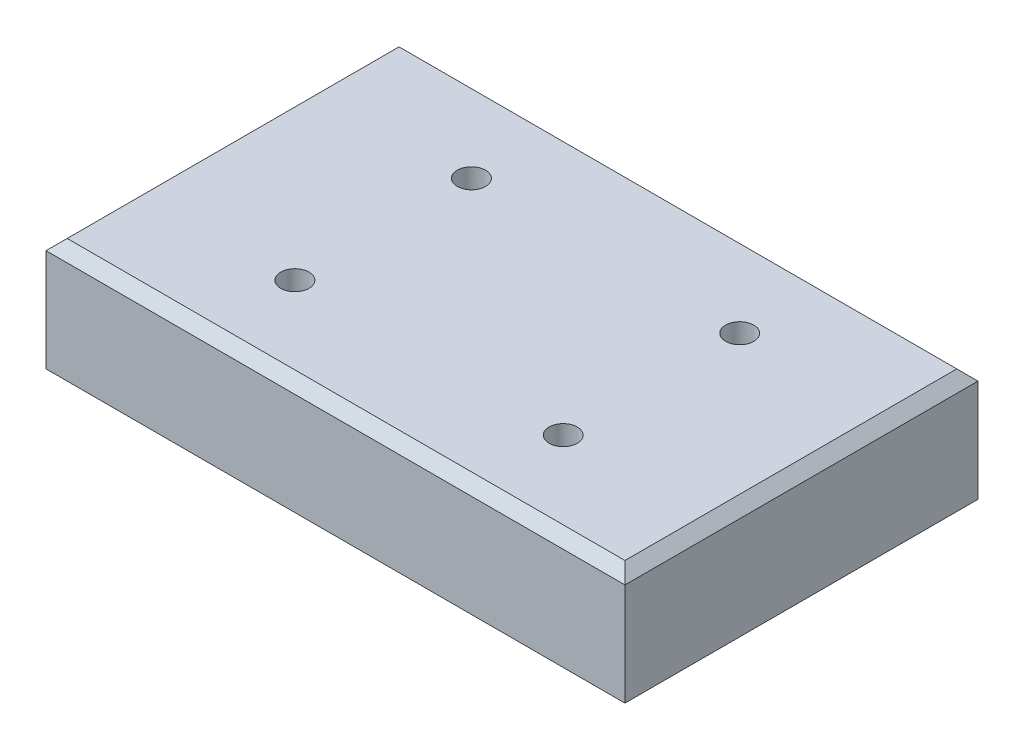
ISO-10303-21;
HEADER;
FILE_DESCRIPTION(('STEP AP214'),'2;1');
FILE_NAME('part.step','',(''),(''),'','','');
FILE_SCHEMA(('AUTOMOTIVE_DESIGN { 1 0 10303 214 1 1 1 1 }'));
ENDSEC;
DATA;
#1=APPLICATION_CONTEXT('core data for automotive mechanical design processes');
#2=APPLICATION_PROTOCOL_DEFINITION('international standard','automotive_design',2000,#1);
#3=PRODUCT_CONTEXT('',#1,'mechanical');
#4=PRODUCT('Part','Part','',(#3));
#5=PRODUCT_RELATED_PRODUCT_CATEGORY('part','',(#4));
#6=PRODUCT_DEFINITION_FORMATION('','',#4);
#7=PRODUCT_DEFINITION_CONTEXT('part definition',#1,'design');
#8=PRODUCT_DEFINITION('design','',#6,#7);
#9=PRODUCT_DEFINITION_SHAPE('','',#8);
#10=(LENGTH_UNIT() NAMED_UNIT(*) SI_UNIT(.MILLI.,.METRE.));
#11=(NAMED_UNIT(*) PLANE_ANGLE_UNIT() SI_UNIT($,.RADIAN.));
#12=(NAMED_UNIT(*) SI_UNIT($,.STERADIAN.) SOLID_ANGLE_UNIT());
#13=UNCERTAINTY_MEASURE_WITH_UNIT(LENGTH_MEASURE(1.E-05),#10,'distance_accuracy_value','');
#14=(GEOMETRIC_REPRESENTATION_CONTEXT(3) GLOBAL_UNCERTAINTY_ASSIGNED_CONTEXT((#13)) GLOBAL_UNIT_ASSIGNED_CONTEXT((#10,
#11,#12)) REPRESENTATION_CONTEXT('',''));
#15=CARTESIAN_POINT('',(0.,0.,0.));
#16=DIRECTION('',(0.,0.,1.));
#17=DIRECTION('',(1.,0.,0.));
#18=AXIS2_PLACEMENT_3D('',#15,#16,#17);
#19=CARTESIAN_POINT('',(-41.,16.,-25.));
#20=DIRECTION('',(1.,0.,0.));
#21=DIRECTION('',(0.,0.,-1.));
#22=AXIS2_PLACEMENT_3D('',#19,#20,#21);
#23=PLANE('',#22);
#24=DIRECTION('',(0.,-1.,0.));
#25=VECTOR('',#24,1.);
#26=CARTESIAN_POINT('',(-41.,16.,25.));
#27=LINE('',#26,#25);
#28=CARTESIAN_POINT('',(-41.,14.5,25.));
#29=VERTEX_POINT('',#28);
#30=CARTESIAN_POINT('',(-41.,0.,25.));
#31=VERTEX_POINT('',#30);
#32=EDGE_CURVE('E206',#29,#31,#27,.T.);
#33=ORIENTED_EDGE('',*,*,#32,.F.);
#34=DIRECTION('',(0.,0.,-1.));
#35=VECTOR('',#34,1.);
#36=CARTESIAN_POINT('',(-41.,14.5,-25.));
#37=LINE('',#36,#35);
#38=CARTESIAN_POINT('',(-41.,14.5,-25.));
#39=VERTEX_POINT('',#38);
#40=EDGE_CURVE('E11',#29,#39,#37,.T.);
#41=ORIENTED_EDGE('',*,*,#40,.T.);
#42=DIRECTION('',(0.,-1.,0.));
#43=VECTOR('',#42,1.);
#44=CARTESIAN_POINT('',(-41.,16.,-25.));
#45=LINE('',#44,#43);
#46=CARTESIAN_POINT('',(-41.,0.,-25.));
#47=VERTEX_POINT('',#46);
#48=EDGE_CURVE('E197',#39,#47,#45,.T.);
#49=ORIENTED_EDGE('',*,*,#48,.T.);
#50=DIRECTION('',(0.,0.,1.));
#51=VECTOR('',#50,1.);
#52=CARTESIAN_POINT('',(-41.,0.,-25.));
#53=LINE('',#52,#51);
#54=EDGE_CURVE('E181',#47,#31,#53,.T.);
#55=ORIENTED_EDGE('',*,*,#54,.T.);
#56=EDGE_LOOP('',(#33,#41,#49,#55));
#57=FACE_BOUND('',#56,.T.);
#58=ADVANCED_FACE('F48',(#57),#23,.F.);
#59=CARTESIAN_POINT('',(41.,16.,25.));
#60=DIRECTION('',(0.,0.,-1.));
#61=DIRECTION('',(-1.,0.,0.));
#62=AXIS2_PLACEMENT_3D('',#59,#60,#61);
#63=PLANE('',#62);
#64=DIRECTION('',(0.,-1.,0.));
#65=VECTOR('',#64,1.);
#66=CARTESIAN_POINT('',(41.,16.,25.));
#67=LINE('',#66,#65);
#68=CARTESIAN_POINT('',(41.,14.5,25.));
#69=VERTEX_POINT('',#68);
#70=CARTESIAN_POINT('',(41.,0.,25.));
#71=VERTEX_POINT('',#70);
#72=EDGE_CURVE('E203',#69,#71,#67,.T.);
#73=ORIENTED_EDGE('',*,*,#72,.F.);
#74=DIRECTION('',(-1.,0.,0.));
#75=VECTOR('',#74,1.);
#76=CARTESIAN_POINT('',(41.,14.5,25.));
#77=LINE('',#76,#75);
#78=EDGE_CURVE('E59',#69,#29,#77,.T.);
#79=ORIENTED_EDGE('',*,*,#78,.T.);
#80=ORIENTED_EDGE('',*,*,#32,.T.);
#81=DIRECTION('',(1.,0.,0.));
#82=VECTOR('',#81,1.);
#83=CARTESIAN_POINT('',(41.,0.,25.));
#84=LINE('',#83,#82);
#85=EDGE_CURVE('E185',#31,#71,#84,.T.);
#86=ORIENTED_EDGE('',*,*,#85,.T.);
#87=EDGE_LOOP('',(#73,#79,#80,#86));
#88=FACE_BOUND('',#87,.T.);
#89=ADVANCED_FACE('F281',(#88),#63,.F.);
#90=CARTESIAN_POINT('',(41.,16.,-25.));
#91=DIRECTION('',(-1.,0.,0.));
#92=DIRECTION('',(0.,0.,1.));
#93=AXIS2_PLACEMENT_3D('',#90,#91,#92);
#94=PLANE('',#93);
#95=DIRECTION('',(0.,-1.,0.));
#96=VECTOR('',#95,1.);
#97=CARTESIAN_POINT('',(41.,16.,-25.));
#98=LINE('',#97,#96);
#99=CARTESIAN_POINT('',(41.,14.5,-25.));
#100=VERTEX_POINT('',#99);
#101=CARTESIAN_POINT('',(41.,0.,-25.));
#102=VERTEX_POINT('',#101);
#103=EDGE_CURVE('E200',#100,#102,#98,.T.);
#104=ORIENTED_EDGE('',*,*,#103,.F.);
#105=DIRECTION('',(0.,0.,1.));
#106=VECTOR('',#105,1.);
#107=CARTESIAN_POINT('',(41.,14.5,-25.));
#108=LINE('',#107,#106);
#109=EDGE_CURVE('E222',#100,#69,#108,.T.);
#110=ORIENTED_EDGE('',*,*,#109,.T.);
#111=ORIENTED_EDGE('',*,*,#72,.T.);
#112=DIRECTION('',(0.,0.,-1.));
#113=VECTOR('',#112,1.);
#114=CARTESIAN_POINT('',(41.,0.,-25.));
#115=LINE('',#114,#113);
#116=EDGE_CURVE('E189',#71,#102,#115,.T.);
#117=ORIENTED_EDGE('',*,*,#116,.T.);
#118=EDGE_LOOP('',(#104,#110,#111,#117));
#119=FACE_BOUND('',#118,.T.);
#120=ADVANCED_FACE('F258',(#119),#94,.F.);
#121=CARTESIAN_POINT('',(41.,16.,-25.));
#122=DIRECTION('',(0.,0.,1.));
#123=DIRECTION('',(1.,0.,0.));
#124=AXIS2_PLACEMENT_3D('',#121,#122,#123);
#125=PLANE('',#124);
#126=ORIENTED_EDGE('',*,*,#48,.F.);
#127=DIRECTION('',(1.,0.,0.));
#128=VECTOR('',#127,1.);
#129=CARTESIAN_POINT('',(41.,14.5,-25.));
#130=LINE('',#129,#128);
#131=EDGE_CURVE('E226',#39,#100,#130,.T.);
#132=ORIENTED_EDGE('',*,*,#131,.T.);
#133=ORIENTED_EDGE('',*,*,#103,.T.);
#134=DIRECTION('',(-1.,0.,0.));
#135=VECTOR('',#134,1.);
#136=CARTESIAN_POINT('',(41.,0.,-25.));
#137=LINE('',#136,#135);
#138=EDGE_CURVE('E193',#102,#47,#137,.T.);
#139=ORIENTED_EDGE('',*,*,#138,.T.);
#140=EDGE_LOOP('',(#126,#132,#133,#139));
#141=FACE_BOUND('',#140,.T.);
#142=ADVANCED_FACE('F255',(#141),#125,.F.);
#143=CARTESIAN_POINT('',(0.,16.,0.));
#144=DIRECTION('',(0.,-1.,0.));
#145=DIRECTION('',(0.,0.,-1.));
#146=AXIS2_PLACEMENT_3D('',#143,#144,#145);
#147=PLANE('',#146);
#148=CARTESIAN_POINT('',(19.75,16.,-12.5));
#149=DIRECTION('',(0.,1.,0.));
#150=DIRECTION('',(0.,0.,1.));
#151=AXIS2_PLACEMENT_3D('',#148,#149,#150);
#152=CIRCLE('',#151,1.99999999999999);
#153=CARTESIAN_POINT('',(19.75,16.,-10.5));
#154=VERTEX_POINT('',#153);
#155=EDGE_CURVE('E620',#154,#154,#152,.T.);
#156=ORIENTED_EDGE('',*,*,#155,.F.);
#157=EDGE_LOOP('',(#156));
#158=FACE_BOUND('',#157,.T.);
#159=CARTESIAN_POINT('',(-18.25,16.,-12.5));
#160=DIRECTION('',(0.,1.,0.));
#161=DIRECTION('',(0.,0.,1.));
#162=AXIS2_PLACEMENT_3D('',#159,#160,#161);
#163=CIRCLE('',#162,1.99999999999999);
#164=CARTESIAN_POINT('',(-18.25,16.,-10.5));
#165=VERTEX_POINT('',#164);
#166=EDGE_CURVE('E124',#165,#165,#163,.T.);
#167=ORIENTED_EDGE('',*,*,#166,.F.);
#168=EDGE_LOOP('',(#167));
#169=FACE_BOUND('',#168,.T.);
#170=CARTESIAN_POINT('',(19.75,16.,12.5));
#171=DIRECTION('',(0.,1.,0.));
#172=DIRECTION('',(0.,0.,1.));
#173=AXIS2_PLACEMENT_3D('',#170,#171,#172);
#174=CIRCLE('',#173,1.99999999999999);
#175=CARTESIAN_POINT('',(19.75,16.,14.5));
#176=VERTEX_POINT('',#175);
#177=EDGE_CURVE('E148',#176,#176,#174,.T.);
#178=ORIENTED_EDGE('',*,*,#177,.F.);
#179=EDGE_LOOP('',(#178));
#180=FACE_BOUND('',#179,.T.);
#181=CARTESIAN_POINT('',(-18.25,16.,12.5));
#182=DIRECTION('',(0.,1.,0.));
#183=DIRECTION('',(0.,0.,1.));
#184=AXIS2_PLACEMENT_3D('',#181,#182,#183);
#185=CIRCLE('',#184,1.99999999999999);
#186=CARTESIAN_POINT('',(-18.25,16.,14.5));
#187=VERTEX_POINT('',#186);
#188=EDGE_CURVE('E164',#187,#187,#185,.T.);
#189=ORIENTED_EDGE('',*,*,#188,.F.);
#190=EDGE_LOOP('',(#189));
#191=FACE_BOUND('',#190,.T.);
#192=DIRECTION('',(1.,0.,0.));
#193=VECTOR('',#192,1.);
#194=CARTESIAN_POINT('',(0.,16.,23.5));
#195=LINE('',#194,#193);
#196=CARTESIAN_POINT('',(-39.5,16.,23.5));
#197=VERTEX_POINT('',#196);
#198=CARTESIAN_POINT('',(39.5,16.,23.5));
#199=VERTEX_POINT('',#198);
#200=EDGE_CURVE('E212',#197,#199,#195,.T.);
#201=ORIENTED_EDGE('',*,*,#200,.T.);
#202=DIRECTION('',(0.,0.,-1.));
#203=VECTOR('',#202,1.);
#204=CARTESIAN_POINT('',(39.5,16.,0.));
#205=LINE('',#204,#203);
#206=CARTESIAN_POINT('',(39.5,16.,-23.5));
#207=VERTEX_POINT('',#206);
#208=EDGE_CURVE('E218',#199,#207,#205,.T.);
#209=ORIENTED_EDGE('',*,*,#208,.T.);
#210=DIRECTION('',(-1.,0.,0.));
#211=VECTOR('',#210,1.);
#212=CARTESIAN_POINT('',(0.,16.,-23.5));
#213=LINE('',#212,#211);
#214=CARTESIAN_POINT('',(-39.5,16.,-23.5));
#215=VERTEX_POINT('',#214);
#216=EDGE_CURVE('E215',#207,#215,#213,.T.);
#217=ORIENTED_EDGE('',*,*,#216,.T.);
#218=DIRECTION('',(0.,0.,1.));
#219=VECTOR('',#218,1.);
#220=CARTESIAN_POINT('',(-39.5,16.,0.));
#221=LINE('',#220,#219);
#222=EDGE_CURVE('E209',#215,#197,#221,.T.);
#223=ORIENTED_EDGE('',*,*,#222,.T.);
#224=EDGE_LOOP('',(#201,#209,#217,#223));
#225=FACE_BOUND('',#224,.T.);
#226=ADVANCED_FACE('F265',(#158,#169,#180,#191,#225),#147,.F.);
#227=CARTESIAN_POINT('',(0.,0.,0.));
#228=DIRECTION('',(0.,-1.,0.));
#229=DIRECTION('',(0.,0.,-1.));
#230=AXIS2_PLACEMENT_3D('',#227,#228,#229);
#231=PLANE('',#230);
#232=ORIENTED_EDGE('',*,*,#54,.F.);
#233=ORIENTED_EDGE('',*,*,#138,.F.);
#234=ORIENTED_EDGE('',*,*,#116,.F.);
#235=ORIENTED_EDGE('',*,*,#85,.F.);
#236=EDGE_LOOP('',(#232,#233,#234,#235));
#237=FACE_BOUND('',#236,.T.);
#238=ADVANCED_FACE('F267',(#237),#231,.T.);
#239=CARTESIAN_POINT('',(-39.5,16.,0.));
#240=DIRECTION('',(0.707106781186551,-0.707106781186544,0.));
#241=DIRECTION('',(0.,0.,1.));
#242=AXIS2_PLACEMENT_3D('',#239,#240,#241);
#243=PLANE('',#242);
#244=DIRECTION('',(-0.577350269189623,-0.577350269189629,-0.577350269189625));
#245=VECTOR('',#244,1.);
#246=CARTESIAN_POINT('',(-31.6666666666667,23.8333333333334,-15.6666666666667));
#247=LINE('',#246,#245);
#248=EDGE_CURVE('E235',#39,#215,#247,.F.);
#249=ORIENTED_EDGE('',*,*,#248,.F.);
#250=ORIENTED_EDGE('',*,*,#40,.F.);
#251=DIRECTION('',(0.577350269189624,0.577350269189629,-0.577350269189624));
#252=VECTOR('',#251,1.);
#253=CARTESIAN_POINT('',(-31.6666666666667,23.8333333333334,15.6666666666667));
#254=LINE('',#253,#252);
#255=EDGE_CURVE('E53',#197,#29,#254,.F.);
#256=ORIENTED_EDGE('',*,*,#255,.F.);
#257=ORIENTED_EDGE('',*,*,#222,.F.);
#258=EDGE_LOOP('',(#249,#250,#256,#257));
#259=FACE_BOUND('',#258,.T.);
#260=ADVANCED_FACE('F51',(#259),#243,.F.);
#261=CARTESIAN_POINT('',(0.,16.,23.5));
#262=DIRECTION('',(0.,-0.707106781186544,-0.707106781186551));
#263=DIRECTION('',(1.,0.,0.));
#264=AXIS2_PLACEMENT_3D('',#261,#262,#263);
#265=PLANE('',#264);
#266=ORIENTED_EDGE('',*,*,#255,.T.);
#267=ORIENTED_EDGE('',*,*,#78,.F.);
#268=DIRECTION('',(-0.577350269189624,0.577350269189629,-0.577350269189624));
#269=VECTOR('',#268,1.);
#270=CARTESIAN_POINT('',(26.3333333333334,29.1666666666667,10.3333333333334));
#271=LINE('',#270,#269);
#272=EDGE_CURVE('E233',#199,#69,#271,.F.);
#273=ORIENTED_EDGE('',*,*,#272,.F.);
#274=ORIENTED_EDGE('',*,*,#200,.F.);
#275=EDGE_LOOP('',(#266,#267,#273,#274));
#276=FACE_BOUND('',#275,.T.);
#277=ADVANCED_FACE('F247',(#276),#265,.F.);
#278=CARTESIAN_POINT('',(0.,16.,-23.5));
#279=DIRECTION('',(0.,-0.707106781186545,0.70710678118655));
#280=DIRECTION('',(-1.,0.,0.));
#281=AXIS2_PLACEMENT_3D('',#278,#279,#280);
#282=PLANE('',#281);
#283=ORIENTED_EDGE('',*,*,#248,.T.);
#284=ORIENTED_EDGE('',*,*,#216,.F.);
#285=DIRECTION('',(0.577350269189623,-0.577350269189629,-0.577350269189625));
#286=VECTOR('',#285,1.);
#287=CARTESIAN_POINT('',(26.3333333333334,29.1666666666667,-10.3333333333334));
#288=LINE('',#287,#286);
#289=EDGE_CURVE('E180',#100,#207,#288,.F.);
#290=ORIENTED_EDGE('',*,*,#289,.F.);
#291=ORIENTED_EDGE('',*,*,#131,.F.);
#292=EDGE_LOOP('',(#283,#284,#290,#291));
#293=FACE_BOUND('',#292,.T.);
#294=ADVANCED_FACE('F252',(#293),#282,.F.);
#295=CARTESIAN_POINT('',(39.5,16.,0.));
#296=DIRECTION('',(-0.707106781186551,-0.707106781186544,0.));
#297=DIRECTION('',(0.,0.,-1.));
#298=AXIS2_PLACEMENT_3D('',#295,#296,#297);
#299=PLANE('',#298);
#300=ORIENTED_EDGE('',*,*,#272,.T.);
#301=ORIENTED_EDGE('',*,*,#109,.F.);
#302=ORIENTED_EDGE('',*,*,#289,.T.);
#303=ORIENTED_EDGE('',*,*,#208,.F.);
#304=EDGE_LOOP('',(#300,#301,#302,#303));
#305=FACE_BOUND('',#304,.T.);
#306=ADVANCED_FACE('F262',(#305),#299,.F.);
#307=CARTESIAN_POINT('',(-18.25,5.9,12.5));
#308=DIRECTION('',(0.,1.,0.));
#309=DIRECTION('',(0.,0.,1.));
#310=AXIS2_PLACEMENT_3D('',#307,#308,#309);
#311=CONICAL_SURFACE('',#310,1.65,1.02974425867665);
#312=CARTESIAN_POINT('',(-18.25,4.90857997860453,12.5));
#313=VERTEX_POINT('',#312);
#314=VERTEX_LOOP('',#313);
#315=FACE_BOUND('',#314,.T.);
#316=CARTESIAN_POINT('',(-18.25,5.9,12.5));
#317=DIRECTION('',(0.,1.,0.));
#318=DIRECTION('',(0.,0.,1.));
#319=AXIS2_PLACEMENT_3D('',#316,#317,#318);
#320=CIRCLE('',#319,1.65);
#321=CARTESIAN_POINT('',(-18.25,5.9,14.15));
#322=VERTEX_POINT('',#321);
#323=EDGE_CURVE('E176',#322,#322,#320,.T.);
#324=ORIENTED_EDGE('',*,*,#323,.T.);
#325=EDGE_LOOP('',(#324));
#326=FACE_BOUND('',#325,.T.);
#327=ADVANCED_FACE('F295',(#315,#326),#311,.F.);
#328=CARTESIAN_POINT('',(-18.25,16.,12.5));
#329=DIRECTION('',(0.,1.,0.));
#330=DIRECTION('',(0.,0.,1.));
#331=AXIS2_PLACEMENT_3D('',#328,#329,#330);
#332=CYLINDRICAL_SURFACE('',#331,1.65);
#333=ORIENTED_EDGE('',*,*,#323,.F.);
#334=EDGE_LOOP('',(#333));
#335=FACE_BOUND('',#334,.T.);
#336=CARTESIAN_POINT('',(-18.25,8.,12.5));
#337=DIRECTION('',(0.,1.,0.));
#338=DIRECTION('',(0.,0.,1.));
#339=AXIS2_PLACEMENT_3D('',#336,#337,#338);
#340=CIRCLE('',#339,1.65);
#341=CARTESIAN_POINT('',(-18.25,8.,14.15));
#342=VERTEX_POINT('',#341);
#343=EDGE_CURVE('E172',#342,#342,#340,.T.);
#344=ORIENTED_EDGE('',*,*,#343,.T.);
#345=EDGE_LOOP('',(#344));
#346=FACE_BOUND('',#345,.T.);
#347=ADVANCED_FACE('F403',(#335,#346),#332,.F.);
#348=CARTESIAN_POINT('',(-16.6,8.,12.5));
#349=DIRECTION('',(0.,-1.,0.));
#350=DIRECTION('',(0.,0.,-1.));
#351=AXIS2_PLACEMENT_3D('',#348,#349,#350);
#352=PLANE('',#351);
#353=ORIENTED_EDGE('',*,*,#343,.F.);
#354=EDGE_LOOP('',(#353));
#355=FACE_BOUND('',#354,.T.);
#356=CARTESIAN_POINT('',(-18.25,8.,12.5));
#357=DIRECTION('',(0.,1.,0.));
#358=DIRECTION('',(0.,0.,1.));
#359=AXIS2_PLACEMENT_3D('',#356,#357,#358);
#360=CIRCLE('',#359,1.99999999999999);
#361=CARTESIAN_POINT('',(-18.25,8.,14.5));
#362=VERTEX_POINT('',#361);
#363=EDGE_CURVE('E168',#362,#362,#360,.T.);
#364=ORIENTED_EDGE('',*,*,#363,.T.);
#365=EDGE_LOOP('',(#364));
#366=FACE_BOUND('',#365,.T.);
#367=ADVANCED_FACE('F414',(#355,#366),#352,.F.);
#368=CARTESIAN_POINT('',(-18.25,16.,12.5));
#369=DIRECTION('',(0.,1.,0.));
#370=DIRECTION('',(0.,0.,1.));
#371=AXIS2_PLACEMENT_3D('',#368,#369,#370);
#372=CYLINDRICAL_SURFACE('',#371,1.99999999999999);
#373=ORIENTED_EDGE('',*,*,#363,.F.);
#374=EDGE_LOOP('',(#373));
#375=FACE_BOUND('',#374,.T.);
#376=ORIENTED_EDGE('',*,*,#188,.T.);
#377=EDGE_LOOP('',(#376));
#378=FACE_BOUND('',#377,.T.);
#379=ADVANCED_FACE('F426',(#375,#378),#372,.F.);
#380=CARTESIAN_POINT('',(19.75,5.9,12.5));
#381=DIRECTION('',(0.,1.,0.));
#382=DIRECTION('',(0.,0.,1.));
#383=AXIS2_PLACEMENT_3D('',#380,#381,#382);
#384=CONICAL_SURFACE('',#383,1.65,1.02974425867665);
#385=CARTESIAN_POINT('',(19.75,4.90857997860453,12.5));
#386=VERTEX_POINT('',#385);
#387=VERTEX_LOOP('',#386);
#388=FACE_BOUND('',#387,.T.);
#389=CARTESIAN_POINT('',(19.75,5.9,12.5));
#390=DIRECTION('',(0.,1.,0.));
#391=DIRECTION('',(0.,0.,1.));
#392=AXIS2_PLACEMENT_3D('',#389,#390,#391);
#393=CIRCLE('',#392,1.65);
#394=CARTESIAN_POINT('',(19.75,5.9,14.15));
#395=VERTEX_POINT('',#394);
#396=EDGE_CURVE('E160',#395,#395,#393,.T.);
#397=ORIENTED_EDGE('',*,*,#396,.T.);
#398=EDGE_LOOP('',(#397));
#399=FACE_BOUND('',#398,.T.);
#400=ADVANCED_FACE('F438',(#388,#399),#384,.F.);
#401=CARTESIAN_POINT('',(19.75,16.,12.5));
#402=DIRECTION('',(0.,1.,0.));
#403=DIRECTION('',(0.,0.,1.));
#404=AXIS2_PLACEMENT_3D('',#401,#402,#403);
#405=CYLINDRICAL_SURFACE('',#404,1.65);
#406=ORIENTED_EDGE('',*,*,#396,.F.);
#407=EDGE_LOOP('',(#406));
#408=FACE_BOUND('',#407,.T.);
#409=CARTESIAN_POINT('',(19.75,8.,12.5));
#410=DIRECTION('',(0.,1.,0.));
#411=DIRECTION('',(0.,0.,1.));
#412=AXIS2_PLACEMENT_3D('',#409,#410,#411);
#413=CIRCLE('',#412,1.65);
#414=CARTESIAN_POINT('',(19.75,8.,14.15));
#415=VERTEX_POINT('',#414);
#416=EDGE_CURVE('E156',#415,#415,#413,.T.);
#417=ORIENTED_EDGE('',*,*,#416,.T.);
#418=EDGE_LOOP('',(#417));
#419=FACE_BOUND('',#418,.T.);
#420=ADVANCED_FACE('F450',(#408,#419),#405,.F.);
#421=CARTESIAN_POINT('',(21.4,8.,12.5));
#422=DIRECTION('',(0.,-1.,0.));
#423=DIRECTION('',(0.,0.,-1.));
#424=AXIS2_PLACEMENT_3D('',#421,#422,#423);
#425=PLANE('',#424);
#426=ORIENTED_EDGE('',*,*,#416,.F.);
#427=EDGE_LOOP('',(#426));
#428=FACE_BOUND('',#427,.T.);
#429=CARTESIAN_POINT('',(19.75,8.,12.5));
#430=DIRECTION('',(0.,1.,0.));
#431=DIRECTION('',(0.,0.,1.));
#432=AXIS2_PLACEMENT_3D('',#429,#430,#431);
#433=CIRCLE('',#432,1.99999999999999);
#434=CARTESIAN_POINT('',(19.75,8.,14.5));
#435=VERTEX_POINT('',#434);
#436=EDGE_CURVE('E152',#435,#435,#433,.T.);
#437=ORIENTED_EDGE('',*,*,#436,.T.);
#438=EDGE_LOOP('',(#437));
#439=FACE_BOUND('',#438,.T.);
#440=ADVANCED_FACE('F462',(#428,#439),#425,.F.);
#441=CARTESIAN_POINT('',(19.75,16.,12.5));
#442=DIRECTION('',(0.,1.,0.));
#443=DIRECTION('',(0.,0.,1.));
#444=AXIS2_PLACEMENT_3D('',#441,#442,#443);
#445=CYLINDRICAL_SURFACE('',#444,1.99999999999999);
#446=ORIENTED_EDGE('',*,*,#436,.F.);
#447=EDGE_LOOP('',(#446));
#448=FACE_BOUND('',#447,.T.);
#449=ORIENTED_EDGE('',*,*,#177,.T.);
#450=EDGE_LOOP('',(#449));
#451=FACE_BOUND('',#450,.T.);
#452=ADVANCED_FACE('F474',(#448,#451),#445,.F.);
#453=CARTESIAN_POINT('',(-18.25,5.9,-12.5));
#454=DIRECTION('',(0.,1.,0.));
#455=DIRECTION('',(0.,0.,1.));
#456=AXIS2_PLACEMENT_3D('',#453,#454,#455);
#457=CONICAL_SURFACE('',#456,1.65,1.02974425867665);
#458=CARTESIAN_POINT('',(-18.25,4.90857997860453,-12.5));
#459=VERTEX_POINT('',#458);
#460=VERTEX_LOOP('',#459);
#461=FACE_BOUND('',#460,.T.);
#462=CARTESIAN_POINT('',(-18.25,5.9,-12.5));
#463=DIRECTION('',(0.,1.,0.));
#464=DIRECTION('',(0.,0.,1.));
#465=AXIS2_PLACEMENT_3D('',#462,#463,#464);
#466=CIRCLE('',#465,1.65);
#467=CARTESIAN_POINT('',(-18.25,5.9,-10.85));
#468=VERTEX_POINT('',#467);
#469=EDGE_CURVE('E144',#468,#468,#466,.T.);
#470=ORIENTED_EDGE('',*,*,#469,.T.);
#471=EDGE_LOOP('',(#470));
#472=FACE_BOUND('',#471,.T.);
#473=ADVANCED_FACE('F486',(#461,#472),#457,.F.);
#474=CARTESIAN_POINT('',(-18.25,16.,-12.5));
#475=DIRECTION('',(0.,1.,0.));
#476=DIRECTION('',(0.,0.,1.));
#477=AXIS2_PLACEMENT_3D('',#474,#475,#476);
#478=CYLINDRICAL_SURFACE('',#477,1.65);
#479=ORIENTED_EDGE('',*,*,#469,.F.);
#480=EDGE_LOOP('',(#479));
#481=FACE_BOUND('',#480,.T.);
#482=CARTESIAN_POINT('',(-18.25,8.,-12.5));
#483=DIRECTION('',(0.,1.,0.));
#484=DIRECTION('',(0.,0.,1.));
#485=AXIS2_PLACEMENT_3D('',#482,#483,#484);
#486=CIRCLE('',#485,1.65);
#487=CARTESIAN_POINT('',(-18.25,8.,-10.85));
#488=VERTEX_POINT('',#487);
#489=EDGE_CURVE('E140',#488,#488,#486,.T.);
#490=ORIENTED_EDGE('',*,*,#489,.T.);
#491=EDGE_LOOP('',(#490));
#492=FACE_BOUND('',#491,.T.);
#493=ADVANCED_FACE('F498',(#481,#492),#478,.F.);
#494=CARTESIAN_POINT('',(-16.6,8.,-12.5));
#495=DIRECTION('',(0.,-1.,0.));
#496=DIRECTION('',(0.,0.,-1.));
#497=AXIS2_PLACEMENT_3D('',#494,#495,#496);
#498=PLANE('',#497);
#499=ORIENTED_EDGE('',*,*,#489,.F.);
#500=EDGE_LOOP('',(#499));
#501=FACE_BOUND('',#500,.T.);
#502=CARTESIAN_POINT('',(-18.25,8.,-12.5));
#503=DIRECTION('',(0.,1.,0.));
#504=DIRECTION('',(0.,0.,1.));
#505=AXIS2_PLACEMENT_3D('',#502,#503,#504);
#506=CIRCLE('',#505,1.99999999999999);
#507=CARTESIAN_POINT('',(-18.25,8.,-10.5));
#508=VERTEX_POINT('',#507);
#509=EDGE_CURVE('E130',#508,#508,#506,.T.);
#510=ORIENTED_EDGE('',*,*,#509,.T.);
#511=EDGE_LOOP('',(#510));
#512=FACE_BOUND('',#511,.T.);
#513=ADVANCED_FACE('F510',(#501,#512),#498,.F.);
#514=CARTESIAN_POINT('',(-18.25,16.,-12.5));
#515=DIRECTION('',(0.,1.,0.));
#516=DIRECTION('',(0.,0.,1.));
#517=AXIS2_PLACEMENT_3D('',#514,#515,#516);
#518=CYLINDRICAL_SURFACE('',#517,1.99999999999999);
#519=ORIENTED_EDGE('',*,*,#509,.F.);
#520=EDGE_LOOP('',(#519));
#521=FACE_BOUND('',#520,.T.);
#522=ORIENTED_EDGE('',*,*,#166,.T.);
#523=EDGE_LOOP('',(#522));
#524=FACE_BOUND('',#523,.T.);
#525=ADVANCED_FACE('F117',(#521,#524),#518,.F.);
#526=CARTESIAN_POINT('',(19.75,5.9,-12.5));
#527=DIRECTION('',(0.,1.,0.));
#528=DIRECTION('',(0.,0.,1.));
#529=AXIS2_PLACEMENT_3D('',#526,#527,#528);
#530=CONICAL_SURFACE('',#529,1.65,1.02974425867665);
#531=CARTESIAN_POINT('',(19.75,4.90857997860453,-12.5));
#532=VERTEX_POINT('',#531);
#533=VERTEX_LOOP('',#532);
#534=FACE_BOUND('',#533,.T.);
#535=CARTESIAN_POINT('',(19.75,5.9,-12.5));
#536=DIRECTION('',(0.,1.,0.));
#537=DIRECTION('',(0.,0.,1.));
#538=AXIS2_PLACEMENT_3D('',#535,#536,#537);
#539=CIRCLE('',#538,1.65);
#540=CARTESIAN_POINT('',(19.75,5.9,-10.85));
#541=VERTEX_POINT('',#540);
#542=EDGE_CURVE('E121',#541,#541,#539,.T.);
#543=ORIENTED_EDGE('',*,*,#542,.T.);
#544=EDGE_LOOP('',(#543));
#545=FACE_BOUND('',#544,.T.);
#546=ADVANCED_FACE('F113',(#534,#545),#530,.F.);
#547=CARTESIAN_POINT('',(19.75,16.,-12.5));
#548=DIRECTION('',(0.,1.,0.));
#549=DIRECTION('',(0.,0.,1.));
#550=AXIS2_PLACEMENT_3D('',#547,#548,#549);
#551=CYLINDRICAL_SURFACE('',#550,1.65);
#552=ORIENTED_EDGE('',*,*,#542,.F.);
#553=EDGE_LOOP('',(#552));
#554=FACE_BOUND('',#553,.T.);
#555=CARTESIAN_POINT('',(19.75,8.,-12.5));
#556=DIRECTION('',(0.,1.,0.));
#557=DIRECTION('',(0.,0.,1.));
#558=AXIS2_PLACEMENT_3D('',#555,#556,#557);
#559=CIRCLE('',#558,1.65);
#560=CARTESIAN_POINT('',(19.75,8.,-10.85));
#561=VERTEX_POINT('',#560);
#562=EDGE_CURVE('E125',#561,#561,#559,.T.);
#563=ORIENTED_EDGE('',*,*,#562,.T.);
#564=EDGE_LOOP('',(#563));
#565=FACE_BOUND('',#564,.T.);
#566=ADVANCED_FACE('F116',(#554,#565),#551,.F.);
#567=CARTESIAN_POINT('',(21.4,8.,-12.5));
#568=DIRECTION('',(0.,-1.,0.));
#569=DIRECTION('',(0.,0.,-1.));
#570=AXIS2_PLACEMENT_3D('',#567,#568,#569);
#571=PLANE('',#570);
#572=ORIENTED_EDGE('',*,*,#562,.F.);
#573=EDGE_LOOP('',(#572));
#574=FACE_BOUND('',#573,.T.);
#575=CARTESIAN_POINT('',(19.75,8.,-12.5));
#576=DIRECTION('',(0.,1.,0.));
#577=DIRECTION('',(0.,0.,1.));
#578=AXIS2_PLACEMENT_3D('',#575,#576,#577);
#579=CIRCLE('',#578,1.99999999999999);
#580=CARTESIAN_POINT('',(19.75,8.,-10.5));
#581=VERTEX_POINT('',#580);
#582=EDGE_CURVE('E133',#581,#581,#579,.T.);
#583=ORIENTED_EDGE('',*,*,#582,.T.);
#584=EDGE_LOOP('',(#583));
#585=FACE_BOUND('',#584,.T.);
#586=ADVANCED_FACE('F552',(#574,#585),#571,.F.);
#587=CARTESIAN_POINT('',(19.75,16.,-12.5));
#588=DIRECTION('',(0.,1.,0.));
#589=DIRECTION('',(0.,0.,1.));
#590=AXIS2_PLACEMENT_3D('',#587,#588,#589);
#591=CYLINDRICAL_SURFACE('',#590,1.99999999999999);
#592=ORIENTED_EDGE('',*,*,#582,.F.);
#593=EDGE_LOOP('',(#592));
#594=FACE_BOUND('',#593,.T.);
#595=ORIENTED_EDGE('',*,*,#155,.T.);
#596=EDGE_LOOP('',(#595));
#597=FACE_BOUND('',#596,.T.);
#598=ADVANCED_FACE('F563',(#594,#597),#591,.F.);
#599=CLOSED_SHELL('',(#58,#89,#120,#142,#226,#238,#260,#277,#294,#306,#327,#347,#367,#379,#400,
#420,#440,#452,#473,#493,#513,#525,#546,#566,#586,#598));
#600=MANIFOLD_SOLID_BREP('B2',#599);
#601=ADVANCED_BREP_SHAPE_REPRESENTATION('',(#18,#600),#14);
#602=SHAPE_DEFINITION_REPRESENTATION(#9,#601);
ENDSEC;
END-ISO-10303-21;
